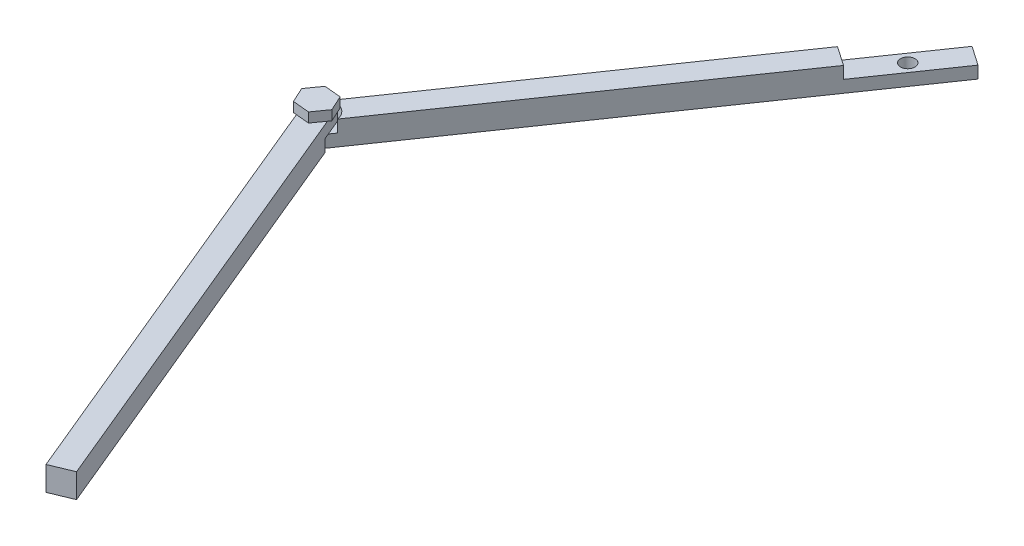
ISO-10303-21;
HEADER;
FILE_DESCRIPTION(('STEP AP214'),'2;1');
FILE_NAME('part.step','',(''),(''),'','','');
FILE_SCHEMA(('AUTOMOTIVE_DESIGN { 1 0 10303 214 1 1 1 1 }'));
ENDSEC;
DATA;
#1=APPLICATION_CONTEXT('core data for automotive mechanical design processes');
#2=APPLICATION_PROTOCOL_DEFINITION('international standard','automotive_design',2000,#1);
#3=PRODUCT_CONTEXT('',#1,'mechanical');
#4=PRODUCT('Part','Part','',(#3));
#5=PRODUCT_RELATED_PRODUCT_CATEGORY('part','',(#4));
#6=PRODUCT_DEFINITION_FORMATION('','',#4);
#7=PRODUCT_DEFINITION_CONTEXT('part definition',#1,'design');
#8=PRODUCT_DEFINITION('design','',#6,#7);
#9=PRODUCT_DEFINITION_SHAPE('','',#8);
#10=(LENGTH_UNIT() NAMED_UNIT(*) SI_UNIT(.MILLI.,.METRE.));
#11=(NAMED_UNIT(*) PLANE_ANGLE_UNIT() SI_UNIT($,.RADIAN.));
#12=(NAMED_UNIT(*) SI_UNIT($,.STERADIAN.) SOLID_ANGLE_UNIT());
#13=UNCERTAINTY_MEASURE_WITH_UNIT(LENGTH_MEASURE(1.E-05),#10,'distance_accuracy_value','');
#14=(GEOMETRIC_REPRESENTATION_CONTEXT(3) GLOBAL_UNCERTAINTY_ASSIGNED_CONTEXT((#13)) GLOBAL_UNIT_ASSIGNED_CONTEXT((#10,
#11,#12)) REPRESENTATION_CONTEXT('',''));
#15=CARTESIAN_POINT('',(0.,0.,0.));
#16=DIRECTION('',(0.,0.,1.));
#17=DIRECTION('',(1.,0.,0.));
#18=AXIS2_PLACEMENT_3D('',#15,#16,#17);
#19=CARTESIAN_POINT('',(50.9795704924562,34.6345094444511,-5.55746916131862));
#20=DIRECTION('',(0.567732858153675,0.,-0.823212853260115));
#21=DIRECTION('',(-0.823212853260115,0.,-0.567732858153675));
#22=AXIS2_PLACEMENT_3D('',#19,#20,#21);
#23=PLANE('',#22);
#24=DIRECTION('',(0.,-1.,0.));
#25=VECTOR('',#24,1.);
#26=CARTESIAN_POINT('',(50.9795704924562,34.6345094444511,-5.55746916131863));
#27=LINE('',#26,#25);
#28=CARTESIAN_POINT('',(50.9795704924562,32.1345094444511,-5.55746916131863));
#29=VERTEX_POINT('',#28);
#30=CARTESIAN_POINT('',(50.9795704924562,29.6345094444511,-5.55746916131863));
#31=VERTEX_POINT('',#30);
#32=EDGE_CURVE('P0_E169',#29,#31,#27,.T.);
#33=ORIENTED_EDGE('',*,*,#32,.F.);
#34=DIRECTION('',(0.823212853260117,0.,0.567732858153672));
#35=VECTOR('',#34,1.);
#36=CARTESIAN_POINT('',(50.9795704924562,32.1345094444511,-5.55746916131863));
#37=LINE('',#36,#35);
#38=CARTESIAN_POINT('',(54.9604379502465,32.1345094444511,-2.81204402516846));
#39=VERTEX_POINT('',#38);
#40=EDGE_CURVE('P0_E126',#29,#39,#37,.T.);
#41=ORIENTED_EDGE('',*,*,#40,.T.);
#42=DIRECTION('',(0.,-1.,0.));
#43=VECTOR('',#42,1.);
#44=CARTESIAN_POINT('',(54.9604379502465,34.6345094444511,-2.81204402516846));
#45=LINE('',#44,#43);
#46=CARTESIAN_POINT('',(54.9604379502465,29.6345094444511,-2.81204402516846));
#47=VERTEX_POINT('',#46);
#48=EDGE_CURVE('P0_E44',#39,#47,#45,.T.);
#49=ORIENTED_EDGE('',*,*,#48,.T.);
#50=DIRECTION('',(0.823212853260115,0.,0.567732858153675));
#51=VECTOR('',#50,1.);
#52=CARTESIAN_POINT('',(50.9795704924562,29.6345094444511,-5.55746916131862));
#53=LINE('',#52,#51);
#54=EDGE_CURVE('P0_E163',#31,#47,#53,.T.);
#55=ORIENTED_EDGE('',*,*,#54,.F.);
#56=EDGE_LOOP('',(#33,#41,#49,#55));
#57=FACE_BOUND('',#56,.T.);
#58=ADVANCED_FACE('P0_F36',(#57),#23,.T.);
#59=CARTESIAN_POINT('',(-5.79371532291128,34.6345094444511,76.7638161646929));
#60=DIRECTION('',(-0.567732858153675,0.,0.823212853260115));
#61=DIRECTION('',(0.823212853260115,0.,0.567732858153675));
#62=AXIS2_PLACEMENT_3D('',#59,#60,#61);
#63=PLANE('',#62);
#64=DIRECTION('',(0.823212853260115,0.,0.567732858153675));
#65=VECTOR('',#64,1.);
#66=CARTESIAN_POINT('',(-1.81284786512099,32.1345094444511,79.5092413008431));
#67=LINE('',#66,#65);
#68=CARTESIAN_POINT('',(-5.79371532291128,32.1345094444511,76.7638161646929));
#69=VERTEX_POINT('',#68);
#70=CARTESIAN_POINT('',(-1.81284786512099,32.1345094444511,79.5092413008431));
#71=VERTEX_POINT('',#70);
#72=EDGE_CURVE('P0_E134',#69,#71,#67,.T.);
#73=ORIENTED_EDGE('',*,*,#72,.F.);
#74=DIRECTION('',(0.,-1.,0.));
#75=VECTOR('',#74,1.);
#76=CARTESIAN_POINT('',(-5.79371532291128,34.6345094444511,76.7638161646929));
#77=LINE('',#76,#75);
#78=CARTESIAN_POINT('',(-5.79371532291128,29.6345094444511,76.7638161646929));
#79=VERTEX_POINT('',#78);
#80=EDGE_CURVE('P0_E154',#69,#79,#77,.T.);
#81=ORIENTED_EDGE('',*,*,#80,.T.);
#82=DIRECTION('',(-0.823212853260115,0.,-0.567732858153675));
#83=VECTOR('',#82,1.);
#84=CARTESIAN_POINT('',(-5.79371532291128,29.6345094444511,76.7638161646929));
#85=LINE('',#84,#83);
#86=CARTESIAN_POINT('',(-1.81284786512098,29.6345094444511,79.5092413008431));
#87=VERTEX_POINT('',#86);
#88=EDGE_CURVE('P0_E157',#87,#79,#85,.T.);
#89=ORIENTED_EDGE('',*,*,#88,.F.);
#90=DIRECTION('',(0.,-1.,0.));
#91=VECTOR('',#90,1.);
#92=CARTESIAN_POINT('',(-1.81284786512098,34.6345094444511,79.5092413008431));
#93=LINE('',#92,#91);
#94=EDGE_CURVE('P0_E11',#71,#87,#93,.T.);
#95=ORIENTED_EDGE('',*,*,#94,.F.);
#96=EDGE_LOOP('',(#73,#81,#89,#95));
#97=FACE_BOUND('',#96,.T.);
#98=ADVANCED_FACE('P0_F192',(#97),#63,.T.);
#99=CARTESIAN_POINT('',(-1.81284786512098,34.6345094444511,79.5092413008431));
#100=DIRECTION('',(0.823212853260115,0.,0.567732858153675));
#101=DIRECTION('',(0.567732858153675,0.,-0.823212853260115));
#102=AXIS2_PLACEMENT_3D('',#99,#100,#101);
#103=PLANE('',#102);
#104=DIRECTION('',(0.,1.,0.));
#105=VECTOR('',#104,1.);
#106=CARTESIAN_POINT('',(43.605780787173,32.1345094444511,13.6522130400339));
#107=LINE('',#106,#105);
#108=CARTESIAN_POINT('',(43.605780787173,32.1345094444511,13.6522130400339));
#109=VERTEX_POINT('',#108);
#110=CARTESIAN_POINT('',(43.605780787173,34.6345094444511,13.6522130400339));
#111=VERTEX_POINT('',#110);
#112=EDGE_CURVE('P0_E99',#109,#111,#107,.T.);
#113=ORIENTED_EDGE('',*,*,#112,.T.);
#114=DIRECTION('',(-0.567732858153675,0.,0.823212853260115));
#115=VECTOR('',#114,1.);
#116=CARTESIAN_POINT('',(-1.81284786512098,34.6345094444511,79.5092413008431));
#117=LINE('',#116,#115);
#118=CARTESIAN_POINT('',(0.907247180101118,34.6345094444511,75.5651024842205));
#119=VERTEX_POINT('',#118);
#120=EDGE_CURVE('P0_E59',#111,#119,#117,.T.);
#121=ORIENTED_EDGE('',*,*,#120,.T.);
#122=DIRECTION('',(0.,1.,0.));
#123=VECTOR('',#122,1.);
#124=CARTESIAN_POINT('',(0.907247180101116,32.1345094444511,75.5651024842205));
#125=LINE('',#124,#123);
#126=CARTESIAN_POINT('',(0.907247180101116,32.1345094444511,75.5651024842205));
#127=VERTEX_POINT('',#126);
#128=EDGE_CURVE('P0_E141',#127,#119,#125,.T.);
#129=ORIENTED_EDGE('',*,*,#128,.F.);
#130=DIRECTION('',(0.567732858153675,0.,-0.823212853260115));
#131=VECTOR('',#130,1.);
#132=CARTESIAN_POINT('',(0.907247180101116,32.1345094444511,75.5651024842205));
#133=LINE('',#132,#131);
#134=EDGE_CURVE('P0_E136',#71,#127,#133,.T.);
#135=ORIENTED_EDGE('',*,*,#134,.F.);
#136=ORIENTED_EDGE('',*,*,#94,.T.);
#137=DIRECTION('',(-0.567732858153675,0.,0.823212853260115));
#138=VECTOR('',#137,1.);
#139=CARTESIAN_POINT('',(-1.81284786512098,29.6345094444511,79.5092413008431));
#140=LINE('',#139,#138);
#141=EDGE_CURVE('P0_E160',#47,#87,#140,.T.);
#142=ORIENTED_EDGE('',*,*,#141,.F.);
#143=ORIENTED_EDGE('',*,*,#48,.F.);
#144=DIRECTION('',(-0.567732858153672,0.,0.823212853260117));
#145=VECTOR('',#144,1.);
#146=CARTESIAN_POINT('',(54.9604379502465,32.1345094444511,-2.81204402516846));
#147=LINE('',#146,#145);
#148=EDGE_CURVE('P0_E110',#39,#109,#147,.T.);
#149=ORIENTED_EDGE('',*,*,#148,.T.);
#150=EDGE_LOOP('',(#113,#121,#129,#135,#136,#142,#143,#149));
#151=FACE_BOUND('',#150,.T.);
#152=ADVANCED_FACE('P0_F116',(#151),#103,.T.);
#153=CARTESIAN_POINT('',(-2.61100080070264,34.6345094444511,76.3726295952229));
#154=DIRECTION('',(0.,-1.,0.));
#155=DIRECTION('',(0.,0.,-1.));
#156=AXIS2_PLACEMENT_3D('',#153,#154,#155);
#157=CYLINDRICAL_SURFACE('',#156,1.49969095397824);
#158=CARTESIAN_POINT('',(-2.61100080070264,32.1345094444511,76.3726295952229));
#159=DIRECTION('',(0.,-1.,0.));
#160=DIRECTION('',(0.,0.,-1.));
#161=AXIS2_PLACEMENT_3D('',#158,#159,#160);
#162=CIRCLE('',#161,1.49969095397824);
#163=CARTESIAN_POINT('',(-2.61100080070264,32.1345094444511,74.8729386412447));
#164=VERTEX_POINT('',#163);
#165=EDGE_CURVE('P0_E143',#164,#164,#162,.T.);
#166=ORIENTED_EDGE('',*,*,#165,.F.);
#167=EDGE_LOOP('',(#166));
#168=FACE_BOUND('',#167,.T.);
#169=CARTESIAN_POINT('',(-2.61100080070264,29.6345094444511,76.3726295952229));
#170=DIRECTION('',(0.,1.,0.));
#171=DIRECTION('',(0.,0.,1.));
#172=AXIS2_PLACEMENT_3D('',#169,#170,#171);
#173=CIRCLE('',#172,1.49969095397824);
#174=CARTESIAN_POINT('',(-2.61100080070264,29.6345094444511,77.8723205492012));
#175=VERTEX_POINT('',#174);
#176=EDGE_CURVE('P0_E148',#175,#175,#173,.T.);
#177=ORIENTED_EDGE('',*,*,#176,.F.);
#178=EDGE_LOOP('',(#177));
#179=FACE_BOUND('',#178,.T.);
#180=ADVANCED_FACE('P0_F38',(#168,#179),#157,.F.);
#181=CARTESIAN_POINT('',(-5.79371532291128,34.6345094444511,76.7638161646929));
#182=DIRECTION('',(-0.823212853260115,0.,-0.567732858153675));
#183=DIRECTION('',(-0.567732858153675,0.,0.823212853260115));
#184=AXIS2_PLACEMENT_3D('',#181,#182,#183);
#185=PLANE('',#184);
#186=DIRECTION('',(0.,1.,0.));
#187=VECTOR('',#186,1.);
#188=CARTESIAN_POINT('',(39.6249133293828,32.1345094444511,10.9067879038837));
#189=LINE('',#188,#187);
#190=CARTESIAN_POINT('',(39.6249133293828,32.1345094444511,10.9067879038837));
#191=VERTEX_POINT('',#190);
#192=CARTESIAN_POINT('',(39.6249133293826,34.6345094444511,10.9067879038838));
#193=VERTEX_POINT('',#192);
#194=EDGE_CURVE('P0_E51',#191,#193,#189,.T.);
#195=ORIENTED_EDGE('',*,*,#194,.F.);
#196=DIRECTION('',(-0.567732858153672,0.,0.823212853260117));
#197=VECTOR('',#196,1.);
#198=CARTESIAN_POINT('',(50.9795704924562,32.1345094444511,-5.55746916131863));
#199=LINE('',#198,#197);
#200=EDGE_CURVE('P0_E113',#29,#191,#199,.T.);
#201=ORIENTED_EDGE('',*,*,#200,.F.);
#202=ORIENTED_EDGE('',*,*,#32,.T.);
#203=DIRECTION('',(0.567732858153675,0.,-0.823212853260115));
#204=VECTOR('',#203,1.);
#205=CARTESIAN_POINT('',(-5.79371532291128,29.6345094444511,76.7638161646929));
#206=LINE('',#205,#204);
#207=EDGE_CURVE('P0_E151',#79,#31,#206,.T.);
#208=ORIENTED_EDGE('',*,*,#207,.F.);
#209=ORIENTED_EDGE('',*,*,#80,.F.);
#210=DIRECTION('',(-0.567732858153675,0.,0.823212853260115));
#211=VECTOR('',#210,1.);
#212=CARTESIAN_POINT('',(-5.79371532291128,32.1345094444511,76.7638161646929));
#213=LINE('',#212,#211);
#214=CARTESIAN_POINT('',(-3.07362027768918,32.1345094444511,72.8196773480703));
#215=VERTEX_POINT('',#214);
#216=EDGE_CURVE('P0_E132',#215,#69,#213,.T.);
#217=ORIENTED_EDGE('',*,*,#216,.F.);
#218=DIRECTION('',(0.,1.,0.));
#219=VECTOR('',#218,1.);
#220=CARTESIAN_POINT('',(-3.07362027768918,32.1345094444511,72.8196773480703));
#221=LINE('',#220,#219);
#222=CARTESIAN_POINT('',(-3.07362027768918,34.6345094444511,72.8196773480703));
#223=VERTEX_POINT('',#222);
#224=EDGE_CURVE('P0_E139',#215,#223,#221,.T.);
#225=ORIENTED_EDGE('',*,*,#224,.T.);
#226=DIRECTION('',(0.567732858153675,0.,-0.823212853260115));
#227=VECTOR('',#226,1.);
#228=CARTESIAN_POINT('',(-5.79371532291128,34.6345094444511,76.7638161646929));
#229=LINE('',#228,#227);
#230=EDGE_CURVE('P0_E150',#223,#193,#229,.T.);
#231=ORIENTED_EDGE('',*,*,#230,.T.);
#232=EDGE_LOOP('',(#195,#201,#202,#208,#209,#217,#225,#231));
#233=FACE_BOUND('',#232,.T.);
#234=ADVANCED_FACE('P0_F181',(#233),#185,.T.);
#235=CARTESIAN_POINT('',(-5.79371532291128,34.6345094444511,76.7638161646929));
#236=DIRECTION('',(0.,1.,0.));
#237=DIRECTION('',(0.,0.,1.));
#238=AXIS2_PLACEMENT_3D('',#235,#236,#237);
#239=PLANE('',#238);
#240=DIRECTION('',(0.823212853260117,0.,0.567732858153672));
#241=VECTOR('',#240,1.);
#242=CARTESIAN_POINT('',(39.6249133293828,34.6345094444511,10.9067879038837));
#243=LINE('',#242,#241);
#244=EDGE_CURVE('P0_E104',#193,#111,#243,.T.);
#245=ORIENTED_EDGE('',*,*,#244,.F.);
#246=ORIENTED_EDGE('',*,*,#230,.F.);
#247=CARTESIAN_POINT('',(-2.45589911686941,34.6345094444511,76.182823645041));
#248=DIRECTION('',(0.,1.,0.));
#249=DIRECTION('',(0.,0.,-1.));
#250=AXIS2_PLACEMENT_3D('',#247,#248,#249);
#251=CIRCLE('',#250,3.41940527685034);
#252=EDGE_CURVE('P0_E106',#119,#223,#251,.T.);
#253=ORIENTED_EDGE('',*,*,#252,.F.);
#254=ORIENTED_EDGE('',*,*,#120,.F.);
#255=EDGE_LOOP('',(#245,#246,#253,#254));
#256=FACE_BOUND('',#255,.T.);
#257=ADVANCED_FACE('P0_F186',(#256),#239,.T.);
#258=CARTESIAN_POINT('',(-5.79371532291128,29.6345094444511,76.7638161646929));
#259=DIRECTION('',(0.,1.,0.));
#260=DIRECTION('',(0.,0.,1.));
#261=AXIS2_PLACEMENT_3D('',#258,#259,#260);
#262=PLANE('',#261);
#263=CARTESIAN_POINT('',(47.2926756398146,29.6345094444511,4.04737193935762));
#264=DIRECTION('',(0.,1.,0.));
#265=DIRECTION('',(0.,0.,1.));
#266=AXIS2_PLACEMENT_3D('',#263,#264,#265);
#267=CIRCLE('',#266,1.5);
#268=CARTESIAN_POINT('',(47.2926756398146,29.6345094444511,5.54737193935762));
#269=VERTEX_POINT('',#268);
#270=EDGE_CURVE('P0_E119',#269,#269,#267,.T.);
#271=ORIENTED_EDGE('',*,*,#270,.T.);
#272=EDGE_LOOP('',(#271));
#273=FACE_BOUND('',#272,.T.);
#274=ORIENTED_EDGE('',*,*,#176,.T.);
#275=EDGE_LOOP('',(#274));
#276=FACE_BOUND('',#275,.T.);
#277=ORIENTED_EDGE('',*,*,#88,.T.);
#278=ORIENTED_EDGE('',*,*,#207,.T.);
#279=ORIENTED_EDGE('',*,*,#54,.T.);
#280=ORIENTED_EDGE('',*,*,#141,.T.);
#281=EDGE_LOOP('',(#277,#278,#279,#280));
#282=FACE_BOUND('',#281,.T.);
#283=ADVANCED_FACE('P0_F177',(#273,#276,#282),#262,.F.);
#284=CARTESIAN_POINT('',(-2.45589911686941,32.1345094444511,76.182823645041));
#285=DIRECTION('',(0.,1.,0.));
#286=DIRECTION('',(0.,0.,1.));
#287=AXIS2_PLACEMENT_3D('',#284,#285,#286);
#288=CYLINDRICAL_SURFACE('',#287,3.41940527685034);
#289=ORIENTED_EDGE('',*,*,#252,.T.);
#290=ORIENTED_EDGE('',*,*,#224,.F.);
#291=CARTESIAN_POINT('',(-2.45589911686941,32.1345094444511,76.182823645041));
#292=DIRECTION('',(0.,1.,0.));
#293=DIRECTION('',(0.,0.,-1.));
#294=AXIS2_PLACEMENT_3D('',#291,#292,#293);
#295=CIRCLE('',#294,3.41940527685034);
#296=EDGE_CURVE('P0_E129',#127,#215,#295,.T.);
#297=ORIENTED_EDGE('',*,*,#296,.F.);
#298=ORIENTED_EDGE('',*,*,#128,.T.);
#299=EDGE_LOOP('',(#289,#290,#297,#298));
#300=FACE_BOUND('',#299,.T.);
#301=ADVANCED_FACE('P0_F188',(#300),#288,.F.);
#302=CARTESIAN_POINT('',(-2.45589911686941,32.1345094444511,76.182823645041));
#303=DIRECTION('',(0.,-1.,0.));
#304=DIRECTION('',(0.,0.,-1.));
#305=AXIS2_PLACEMENT_3D('',#302,#303,#304);
#306=PLANE('',#305);
#307=ORIENTED_EDGE('',*,*,#165,.T.);
#308=EDGE_LOOP('',(#307));
#309=FACE_BOUND('',#308,.T.);
#310=ORIENTED_EDGE('',*,*,#296,.T.);
#311=ORIENTED_EDGE('',*,*,#216,.T.);
#312=ORIENTED_EDGE('',*,*,#72,.T.);
#313=ORIENTED_EDGE('',*,*,#134,.T.);
#314=EDGE_LOOP('',(#310,#311,#312,#313));
#315=FACE_BOUND('',#314,.T.);
#316=ADVANCED_FACE('P0_F193',(#309,#315),#306,.F.);
#317=CARTESIAN_POINT('',(39.6249133293828,32.1345094444511,10.9067879038837));
#318=DIRECTION('',(-0.567732858153672,0.,0.823212853260117));
#319=DIRECTION('',(0.823212853260117,0.,0.567732858153672));
#320=AXIS2_PLACEMENT_3D('',#317,#318,#319);
#321=PLANE('',#320);
#322=ORIENTED_EDGE('',*,*,#244,.T.);
#323=ORIENTED_EDGE('',*,*,#112,.F.);
#324=DIRECTION('',(0.823212853260117,0.,0.567732858153672));
#325=VECTOR('',#324,1.);
#326=CARTESIAN_POINT('',(39.6249133293828,32.1345094444511,10.9067879038837));
#327=LINE('',#326,#325);
#328=EDGE_CURVE('P0_E102',#191,#109,#327,.T.);
#329=ORIENTED_EDGE('',*,*,#328,.F.);
#330=ORIENTED_EDGE('',*,*,#194,.T.);
#331=EDGE_LOOP('',(#322,#323,#329,#330));
#332=FACE_BOUND('',#331,.T.);
#333=ADVANCED_FACE('P0_F101',(#332),#321,.F.);
#334=CARTESIAN_POINT('',(0.,32.1345094444511,0.));
#335=DIRECTION('',(0.,1.,0.));
#336=DIRECTION('',(0.,0.,1.));
#337=AXIS2_PLACEMENT_3D('',#334,#335,#336);
#338=PLANE('',#337);
#339=CARTESIAN_POINT('',(47.2926756398146,32.1345094444511,4.04737193935762));
#340=DIRECTION('',(0.,1.,0.));
#341=DIRECTION('',(0.,0.,1.));
#342=AXIS2_PLACEMENT_3D('',#339,#340,#341);
#343=CIRCLE('',#342,1.5);
#344=CARTESIAN_POINT('',(47.2926756398146,32.1345094444511,5.54737193935762));
#345=VERTEX_POINT('',#344);
#346=EDGE_CURVE('P0_E122',#345,#345,#343,.T.);
#347=ORIENTED_EDGE('',*,*,#346,.F.);
#348=EDGE_LOOP('',(#347));
#349=FACE_BOUND('',#348,.T.);
#350=ORIENTED_EDGE('',*,*,#148,.F.);
#351=ORIENTED_EDGE('',*,*,#40,.F.);
#352=ORIENTED_EDGE('',*,*,#200,.T.);
#353=ORIENTED_EDGE('',*,*,#328,.T.);
#354=EDGE_LOOP('',(#350,#351,#352,#353));
#355=FACE_BOUND('',#354,.T.);
#356=ADVANCED_FACE('P0_F109',(#349,#355),#338,.T.);
#357=CARTESIAN_POINT('',(47.2926756398146,29.6345094444511,4.04737193935762));
#358=DIRECTION('',(0.,1.,0.));
#359=DIRECTION('',(0.,0.,1.));
#360=AXIS2_PLACEMENT_3D('',#357,#358,#359);
#361=CYLINDRICAL_SURFACE('',#360,1.5);
#362=ORIENTED_EDGE('',*,*,#270,.F.);
#363=EDGE_LOOP('',(#362));
#364=FACE_BOUND('',#363,.T.);
#365=ORIENTED_EDGE('',*,*,#346,.T.);
#366=EDGE_LOOP('',(#365));
#367=FACE_BOUND('',#366,.T.);
#368=ADVANCED_FACE('P0_F241',(#364,#367),#361,.F.);
#369=CLOSED_SHELL('',(#58,#98,#152,#180,#234,#257,#283,#301,#316,#333,#356,#368));
#370=MANIFOLD_SOLID_BREP('P0_B2',#369);
#371=CARTESIAN_POINT('',(-2.61100080070264,34.4443084376079,76.3726295952229));
#372=DIRECTION('',(0.,-1.,0.));
#373=DIRECTION('',(0.0942215268961057,0.,-0.995551256274315));
#374=AXIS2_PLACEMENT_3D('',#371,#372,#373);
#375=PLANE('',#374);
#376=CARTESIAN_POINT('',(-2.61100080070264,34.4443084376079,76.3726295952229));
#377=DIRECTION('',(0.,-1.,0.));
#378=DIRECTION('',(0.0942215268961057,0.,-0.995551256274315));
#379=AXIS2_PLACEMENT_3D('',#376,#377,#378);
#380=CIRCLE('',#379,1.704);
#381=CARTESIAN_POINT('',(-2.45044731887168,34.4443084376079,74.6762102545315));
#382=VERTEX_POINT('',#381);
#383=EDGE_CURVE('P1_E126',#382,#382,#380,.F.);
#384=ORIENTED_EDGE('',*,*,#383,.T.);
#385=EDGE_LOOP('',(#384));
#386=FACE_BOUND('',#385,.T.);
#387=CARTESIAN_POINT('',(-2.61100080070264,34.4443084376079,76.3726295952229));
#388=DIRECTION('',(0.,-1.,0.));
#389=DIRECTION('',(0.0942215268961057,0.,-0.995551256274315));
#390=AXIS2_PLACEMENT_3D('',#387,#388,#389);
#391=CIRCLE('',#390,2.5);
#392=CARTESIAN_POINT('',(-2.37544698346238,34.4443084376079,73.8837514545372));
#393=VERTEX_POINT('',#392);
#394=EDGE_CURVE('P1_E107',#393,#393,#391,.T.);
#395=ORIENTED_EDGE('',*,*,#394,.T.);
#396=EDGE_LOOP('',(#395));
#397=FACE_BOUND('',#396,.T.);
#398=ADVANCED_FACE('P1_F17',(#386,#397),#375,.T.);
#399=CARTESIAN_POINT('',(-4.6180107387971,34.8507084376079,79.1960868922951));
#400=DIRECTION('',(0.,-1.,0.));
#401=DIRECTION('',(0.0942215268961057,0.,-0.995551256274315));
#402=AXIS2_PLACEMENT_3D('',#399,#400,#401);
#403=PLANE('',#402);
#404=DIRECTION('',(0.995551256274315,0.,0.0942215268961057));
#405=VECTOR('',#404,1.);
#406=CARTESIAN_POINT('',(-1.16932002398482,34.8507084376079,79.5224798357967));
#407=LINE('',#406,#405);
#408=CARTESIAN_POINT('',(-4.6180107387971,34.8507084376079,79.1960868922951));
#409=VERTEX_POINT('',#408);
#410=CARTESIAN_POINT('',(-1.16932002398482,34.8507084376079,79.5224798357967));
#411=VERTEX_POINT('',#410);
#412=EDGE_CURVE('P1_E103',#409,#411,#407,.T.);
#413=ORIENTED_EDGE('',*,*,#412,.F.);
#414=DIRECTION('',(0.416177392261775,0.,0.90928344215112));
#415=VECTOR('',#414,1.);
#416=CARTESIAN_POINT('',(-4.6180107387971,34.8507084376079,79.1960868922951));
#417=LINE('',#416,#415);
#418=CARTESIAN_POINT('',(-6.05969151551493,34.8507084376079,76.0462366517214));
#419=VERTEX_POINT('',#418);
#420=EDGE_CURVE('P1_E63',#419,#409,#417,.T.);
#421=ORIENTED_EDGE('',*,*,#420,.F.);
#422=DIRECTION('',(-0.579373864012547,0.,0.815061915255013));
#423=VECTOR('',#422,1.);
#424=CARTESIAN_POINT('',(-4.05268157742046,34.8507084376079,73.2227793546492));
#425=LINE('',#424,#423);
#426=CARTESIAN_POINT('',(-4.05268157742046,34.8507084376079,73.2227793546492));
#427=VERTEX_POINT('',#426);
#428=EDGE_CURVE('P1_E57',#427,#419,#425,.T.);
#429=ORIENTED_EDGE('',*,*,#428,.F.);
#430=DIRECTION('',(-0.995551256274315,0.,-0.0942215268961057));
#431=VECTOR('',#430,1.);
#432=CARTESIAN_POINT('',(-0.603990862608186,34.8507084376079,73.5491722981508));
#433=LINE('',#432,#431);
#434=CARTESIAN_POINT('',(-0.603990862608186,34.8507084376079,73.5491722981508));
#435=VERTEX_POINT('',#434);
#436=EDGE_CURVE('P1_E93',#435,#427,#433,.T.);
#437=ORIENTED_EDGE('',*,*,#436,.F.);
#438=DIRECTION('',(-0.416177392261776,0.,-0.909283442151119));
#439=VECTOR('',#438,1.);
#440=CARTESIAN_POINT('',(-0.603990862608186,34.8507084376079,73.5491722981508));
#441=LINE('',#440,#439);
#442=CARTESIAN_POINT('',(0.837689914109652,34.8507084376079,76.6990225387245));
#443=VERTEX_POINT('',#442);
#444=EDGE_CURVE('P1_E109',#443,#435,#441,.T.);
#445=ORIENTED_EDGE('',*,*,#444,.F.);
#446=DIRECTION('',(0.579373864012548,0.,-0.815061915255013));
#447=VECTOR('',#446,1.);
#448=CARTESIAN_POINT('',(-1.16932002398482,34.8507084376079,79.5224798357967));
#449=LINE('',#448,#447);
#450=EDGE_CURVE('P1_E106',#411,#443,#449,.T.);
#451=ORIENTED_EDGE('',*,*,#450,.F.);
#452=EDGE_LOOP('',(#413,#421,#429,#437,#445,#451));
#453=FACE_BOUND('',#452,.T.);
#454=CARTESIAN_POINT('',(-2.61100080070264,34.8507084376079,76.3726295952229));
#455=DIRECTION('',(0.,-1.,0.));
#456=DIRECTION('',(0.0942215268961057,0.,-0.995551256274315));
#457=AXIS2_PLACEMENT_3D('',#454,#455,#456);
#458=CIRCLE('',#457,2.5);
#459=CARTESIAN_POINT('',(-2.37544698346238,34.8507084376079,73.8837514545372));
#460=VERTEX_POINT('',#459);
#461=EDGE_CURVE('P1_E189',#460,#460,#458,.T.);
#462=ORIENTED_EDGE('',*,*,#461,.F.);
#463=EDGE_LOOP('',(#462));
#464=FACE_BOUND('',#463,.T.);
#465=ADVANCED_FACE('P1_F143',(#453,#464),#403,.T.);
#466=CARTESIAN_POINT('',(-1.16932002398482,36.8507084376079,79.5224798357967));
#467=DIRECTION('',(0.0942215268961057,0.,-0.995551256274315));
#468=DIRECTION('',(-0.995551256274315,0.,-0.0942215268961057));
#469=AXIS2_PLACEMENT_3D('',#466,#467,#468);
#470=PLANE('',#469);
#471=ORIENTED_EDGE('',*,*,#412,.T.);
#472=DIRECTION('',(0.,-1.,0.));
#473=VECTOR('',#472,1.);
#474=CARTESIAN_POINT('',(-1.16932002398482,36.8507084376079,79.5224798357967));
#475=LINE('',#474,#473);
#476=CARTESIAN_POINT('',(-1.16932002398482,36.8507084376079,79.5224798357967));
#477=VERTEX_POINT('',#476);
#478=EDGE_CURVE('P1_E121',#477,#411,#475,.T.);
#479=ORIENTED_EDGE('',*,*,#478,.F.);
#480=DIRECTION('',(0.995551256274315,0.,0.0942215268961057));
#481=VECTOR('',#480,1.);
#482=CARTESIAN_POINT('',(-1.16932002398482,36.8507084376079,79.5224798357967));
#483=LINE('',#482,#481);
#484=CARTESIAN_POINT('',(-4.6180107387971,36.8507084376079,79.1960868922951));
#485=VERTEX_POINT('',#484);
#486=EDGE_CURVE('P1_E114',#485,#477,#483,.T.);
#487=ORIENTED_EDGE('',*,*,#486,.F.);
#488=DIRECTION('',(0.,-1.,0.));
#489=VECTOR('',#488,1.);
#490=CARTESIAN_POINT('',(-4.6180107387971,36.8507084376079,79.1960868922951));
#491=LINE('',#490,#489);
#492=EDGE_CURVE('P1_E99',#485,#409,#491,.T.);
#493=ORIENTED_EDGE('',*,*,#492,.T.);
#494=EDGE_LOOP('',(#471,#479,#487,#493));
#495=FACE_BOUND('',#494,.T.);
#496=ADVANCED_FACE('P1_F149',(#495),#470,.F.);
#497=CARTESIAN_POINT('',(-1.16932002398482,36.8507084376079,79.5224798357967));
#498=DIRECTION('',(-0.815061915255013,0.,-0.579373864012548));
#499=DIRECTION('',(-0.579373864012548,0.,0.815061915255013));
#500=AXIS2_PLACEMENT_3D('',#497,#498,#499);
#501=PLANE('',#500);
#502=ORIENTED_EDGE('',*,*,#450,.T.);
#503=DIRECTION('',(0.,-1.,0.));
#504=VECTOR('',#503,1.);
#505=CARTESIAN_POINT('',(0.837689914109652,36.8507084376079,76.6990225387245));
#506=LINE('',#505,#504);
#507=CARTESIAN_POINT('',(0.837689914109652,36.8507084376079,76.6990225387245));
#508=VERTEX_POINT('',#507);
#509=EDGE_CURVE('P1_E118',#508,#443,#506,.T.);
#510=ORIENTED_EDGE('',*,*,#509,.F.);
#511=DIRECTION('',(0.579373864012548,0.,-0.815061915255013));
#512=VECTOR('',#511,1.);
#513=CARTESIAN_POINT('',(-1.16932002398482,36.8507084376079,79.5224798357967));
#514=LINE('',#513,#512);
#515=EDGE_CURVE('P1_E72',#477,#508,#514,.T.);
#516=ORIENTED_EDGE('',*,*,#515,.F.);
#517=ORIENTED_EDGE('',*,*,#478,.T.);
#518=EDGE_LOOP('',(#502,#510,#516,#517));
#519=FACE_BOUND('',#518,.T.);
#520=ADVANCED_FACE('P1_F173',(#519),#501,.F.);
#521=CARTESIAN_POINT('',(-0.603990862608186,36.8507084376079,73.5491722981508));
#522=DIRECTION('',(-0.909283442151119,0.,0.416177392261776));
#523=DIRECTION('',(0.416177392261776,0.,0.909283442151119));
#524=AXIS2_PLACEMENT_3D('',#521,#522,#523);
#525=PLANE('',#524);
#526=ORIENTED_EDGE('',*,*,#444,.T.);
#527=DIRECTION('',(0.,-1.,0.));
#528=VECTOR('',#527,1.);
#529=CARTESIAN_POINT('',(-0.603990862608186,36.8507084376079,73.5491722981508));
#530=LINE('',#529,#528);
#531=CARTESIAN_POINT('',(-0.603990862608186,36.8507084376079,73.5491722981508));
#532=VERTEX_POINT('',#531);
#533=EDGE_CURVE('P1_E94',#532,#435,#530,.T.);
#534=ORIENTED_EDGE('',*,*,#533,.F.);
#535=DIRECTION('',(-0.416177392261776,0.,-0.909283442151119));
#536=VECTOR('',#535,1.);
#537=CARTESIAN_POINT('',(-0.603990862608186,36.8507084376079,73.5491722981508));
#538=LINE('',#537,#536);
#539=EDGE_CURVE('P1_E85',#508,#532,#538,.T.);
#540=ORIENTED_EDGE('',*,*,#539,.F.);
#541=ORIENTED_EDGE('',*,*,#509,.T.);
#542=EDGE_LOOP('',(#526,#534,#540,#541));
#543=FACE_BOUND('',#542,.T.);
#544=ADVANCED_FACE('P1_F170',(#543),#525,.F.);
#545=CARTESIAN_POINT('',(-0.603990862608186,36.8507084376079,73.5491722981508));
#546=DIRECTION('',(-0.0942215268961057,0.,0.995551256274315));
#547=DIRECTION('',(0.995551256274315,0.,0.0942215268961057));
#548=AXIS2_PLACEMENT_3D('',#545,#546,#547);
#549=PLANE('',#548);
#550=ORIENTED_EDGE('',*,*,#436,.T.);
#551=DIRECTION('',(0.,-1.,0.));
#552=VECTOR('',#551,1.);
#553=CARTESIAN_POINT('',(-4.05268157742046,36.8507084376079,73.2227793546492));
#554=LINE('',#553,#552);
#555=CARTESIAN_POINT('',(-4.05268157742046,36.8507084376079,73.2227793546492));
#556=VERTEX_POINT('',#555);
#557=EDGE_CURVE('P1_E90',#556,#427,#554,.T.);
#558=ORIENTED_EDGE('',*,*,#557,.F.);
#559=DIRECTION('',(-0.995551256274315,0.,-0.0942215268961057));
#560=VECTOR('',#559,1.);
#561=CARTESIAN_POINT('',(-0.603990862608186,36.8507084376079,73.5491722981508));
#562=LINE('',#561,#560);
#563=EDGE_CURVE('P1_E79',#532,#556,#562,.T.);
#564=ORIENTED_EDGE('',*,*,#563,.F.);
#565=ORIENTED_EDGE('',*,*,#533,.T.);
#566=EDGE_LOOP('',(#550,#558,#564,#565));
#567=FACE_BOUND('',#566,.T.);
#568=ADVANCED_FACE('P1_F91',(#567),#549,.F.);
#569=CARTESIAN_POINT('',(-4.05268157742046,36.8507084376079,73.2227793546492));
#570=DIRECTION('',(0.815061915255013,0.,0.579373864012547));
#571=DIRECTION('',(0.579373864012547,0.,-0.815061915255013));
#572=AXIS2_PLACEMENT_3D('',#569,#570,#571);
#573=PLANE('',#572);
#574=ORIENTED_EDGE('',*,*,#428,.T.);
#575=DIRECTION('',(0.,-1.,0.));
#576=VECTOR('',#575,1.);
#577=CARTESIAN_POINT('',(-6.05969151551493,36.8507084376079,76.0462366517214));
#578=LINE('',#577,#576);
#579=CARTESIAN_POINT('',(-6.05969151551493,36.8507084376079,76.0462366517214));
#580=VERTEX_POINT('',#579);
#581=EDGE_CURVE('P1_E95',#580,#419,#578,.T.);
#582=ORIENTED_EDGE('',*,*,#581,.F.);
#583=DIRECTION('',(-0.579373864012547,0.,0.815061915255013));
#584=VECTOR('',#583,1.);
#585=CARTESIAN_POINT('',(-4.05268157742046,36.8507084376079,73.2227793546492));
#586=LINE('',#585,#584);
#587=EDGE_CURVE('P1_E83',#556,#580,#586,.T.);
#588=ORIENTED_EDGE('',*,*,#587,.F.);
#589=ORIENTED_EDGE('',*,*,#557,.T.);
#590=EDGE_LOOP('',(#574,#582,#588,#589));
#591=FACE_BOUND('',#590,.T.);
#592=ADVANCED_FACE('P1_F97',(#591),#573,.F.);
#593=CARTESIAN_POINT('',(-4.6180107387971,36.8507084376079,79.1960868922951));
#594=DIRECTION('',(0.90928344215112,0.,-0.416177392261775));
#595=DIRECTION('',(-0.416177392261775,0.,-0.90928344215112));
#596=AXIS2_PLACEMENT_3D('',#593,#594,#595);
#597=PLANE('',#596);
#598=ORIENTED_EDGE('',*,*,#420,.T.);
#599=ORIENTED_EDGE('',*,*,#492,.F.);
#600=DIRECTION('',(0.416177392261775,0.,0.90928344215112));
#601=VECTOR('',#600,1.);
#602=CARTESIAN_POINT('',(-4.6180107387971,36.8507084376079,79.1960868922951));
#603=LINE('',#602,#601);
#604=EDGE_CURVE('P1_E34',#580,#485,#603,.T.);
#605=ORIENTED_EDGE('',*,*,#604,.F.);
#606=ORIENTED_EDGE('',*,*,#581,.T.);
#607=EDGE_LOOP('',(#598,#599,#605,#606));
#608=FACE_BOUND('',#607,.T.);
#609=ADVANCED_FACE('P1_F162',(#608),#597,.F.);
#610=CARTESIAN_POINT('',(-4.6180107387971,36.8507084376079,79.1960868922951));
#611=DIRECTION('',(0.,-1.,0.));
#612=DIRECTION('',(0.0942215268961057,0.,-0.995551256274315));
#613=AXIS2_PLACEMENT_3D('',#610,#611,#612);
#614=PLANE('',#613);
#615=ORIENTED_EDGE('',*,*,#486,.T.);
#616=ORIENTED_EDGE('',*,*,#515,.T.);
#617=ORIENTED_EDGE('',*,*,#539,.T.);
#618=ORIENTED_EDGE('',*,*,#563,.T.);
#619=ORIENTED_EDGE('',*,*,#587,.T.);
#620=ORIENTED_EDGE('',*,*,#604,.T.);
#621=EDGE_LOOP('',(#615,#616,#617,#618,#619,#620));
#622=FACE_BOUND('',#621,.T.);
#623=ADVANCED_FACE('P1_F81',(#622),#614,.F.);
#624=CARTESIAN_POINT('',(-2.61100080070264,34.4443084376079,76.3726295952229));
#625=DIRECTION('',(0.,1.,0.));
#626=DIRECTION('',(-0.0942215268961057,0.,0.995551256274315));
#627=AXIS2_PLACEMENT_3D('',#624,#625,#626);
#628=CYLINDRICAL_SURFACE('',#627,2.5);
#629=ORIENTED_EDGE('',*,*,#394,.F.);
#630=EDGE_LOOP('',(#629));
#631=FACE_BOUND('',#630,.T.);
#632=ORIENTED_EDGE('',*,*,#461,.T.);
#633=EDGE_LOOP('',(#632));
#634=FACE_BOUND('',#633,.T.);
#635=ADVANCED_FACE('P1_F157',(#631,#634),#628,.T.);
#636=CARTESIAN_POINT('',(-2.61100080070264,29.4443084376079,76.3726295952229));
#637=DIRECTION('',(0.,1.,0.));
#638=DIRECTION('',(-0.0942215268961057,0.,0.995551256274315));
#639=AXIS2_PLACEMENT_3D('',#636,#637,#638);
#640=CYLINDRICAL_SURFACE('',#639,1.45);
#641=CARTESIAN_POINT('',(-2.61100080070264,29.8253084376079,76.3726295952229));
#642=DIRECTION('',(0.,-1.,0.));
#643=DIRECTION('',(0.0942215268961057,0.,-0.995551256274315));
#644=AXIS2_PLACEMENT_3D('',#641,#642,#643);
#645=CIRCLE('',#644,1.45);
#646=CARTESIAN_POINT('',(-2.47437958670329,29.8253084376079,74.9290802736252));
#647=VERTEX_POINT('',#646);
#648=EDGE_CURVE('P1_E11',#647,#647,#645,.F.);
#649=ORIENTED_EDGE('',*,*,#648,.T.);
#650=EDGE_LOOP('',(#649));
#651=FACE_BOUND('',#650,.T.);
#652=CARTESIAN_POINT('',(-2.61100080070264,34.1903084376079,76.3726295952229));
#653=DIRECTION('',(0.,-1.,0.));
#654=DIRECTION('',(0.0942215268961057,0.,-0.995551256274315));
#655=AXIS2_PLACEMENT_3D('',#652,#653,#654);
#656=CIRCLE('',#655,1.45);
#657=CARTESIAN_POINT('',(-2.47437958670329,34.1903084376079,74.9290802736252));
#658=VERTEX_POINT('',#657);
#659=EDGE_CURVE('P1_E123',#658,#658,#656,.T.);
#660=ORIENTED_EDGE('',*,*,#659,.T.);
#661=EDGE_LOOP('',(#660));
#662=FACE_BOUND('',#661,.T.);
#663=ADVANCED_FACE('P1_F155',(#651,#662),#640,.T.);
#664=CARTESIAN_POINT('',(-2.61100080070264,29.4443084376079,76.3726295952229));
#665=DIRECTION('',(0.,-1.,0.));
#666=DIRECTION('',(0.0942215268961057,0.,-0.995551256274315));
#667=AXIS2_PLACEMENT_3D('',#664,#665,#666);
#668=PLANE('',#667);
#669=CARTESIAN_POINT('',(-2.61100080070264,29.4443084376079,76.3726295952229));
#670=DIRECTION('',(0.,-1.,0.));
#671=DIRECTION('',(0.0942215268961057,0.,-0.995551256274315));
#672=AXIS2_PLACEMENT_3D('',#669,#670,#671);
#673=CIRCLE('',#672,1.069);
#674=CARTESIAN_POINT('',(-2.51027798845071,29.4443084376079,75.3083853022657));
#675=VERTEX_POINT('',#674);
#676=EDGE_CURVE('P1_E26',#675,#675,#673,.T.);
#677=ORIENTED_EDGE('',*,*,#676,.T.);
#678=EDGE_LOOP('',(#677));
#679=FACE_BOUND('',#678,.T.);
#680=ADVANCED_FACE('P1_F131',(#679),#668,.T.);
#681=CARTESIAN_POINT('',(-2.61100080070264,34.1903084376079,76.3726295952229));
#682=DIRECTION('',(0.,-1.,0.));
#683=DIRECTION('',(0.0942215268961057,0.,-0.995551256274315));
#684=AXIS2_PLACEMENT_3D('',#681,#682,#683);
#685=TOROIDAL_SURFACE('',#684,1.704,0.254);
#686=ORIENTED_EDGE('',*,*,#383,.F.);
#687=EDGE_LOOP('',(#686));
#688=FACE_BOUND('',#687,.T.);
#689=ORIENTED_EDGE('',*,*,#659,.F.);
#690=EDGE_LOOP('',(#689));
#691=FACE_BOUND('',#690,.T.);
#692=ADVANCED_FACE('P1_F134',(#688,#691),#685,.F.);
#693=CARTESIAN_POINT('',(-2.61100080070264,29.4443084376079,76.3726295952229));
#694=DIRECTION('',(0.,1.,0.));
#695=DIRECTION('',(-0.0942215268961057,0.,0.995551256274315));
#696=AXIS2_PLACEMENT_3D('',#693,#694,#695);
#697=CONICAL_SURFACE('',#696,1.069,0.785398163397447);
#698=ORIENTED_EDGE('',*,*,#648,.F.);
#699=EDGE_LOOP('',(#698));
#700=FACE_BOUND('',#699,.T.);
#701=ORIENTED_EDGE('',*,*,#676,.F.);
#702=EDGE_LOOP('',(#701));
#703=FACE_BOUND('',#702,.T.);
#704=ADVANCED_FACE('P1_F19',(#700,#703),#697,.T.);
#705=CLOSED_SHELL('',(#398,#465,#496,#520,#544,#568,#592,#609,#623,#635,#663,#680,#692,#704));
#706=MANIFOLD_SOLID_BREP('P1_B1',#705);
#707=CARTESIAN_POINT('',(-5.64197385568157,29.7225873032574,75.3257766915146));
#708=DIRECTION('',(-0.383412110376767,0.,-0.923577367423235));
#709=DIRECTION('',(0.923577367423235,0.,-0.383412110376767));
#710=AXIS2_PLACEMENT_3D('',#707,#708,#709);
#711=PLANE('',#710);
#712=DIRECTION('',(0.923577367423235,0.,-0.383412110376767));
#713=VECTOR('',#712,1.);
#714=CARTESIAN_POINT('',(-1.17576675970824,32.2225873032574,73.4716841720927));
#715=LINE('',#714,#713);
#716=CARTESIAN_POINT('',(-5.64197385568157,32.2225873032574,75.3257766915146));
#717=VERTEX_POINT('',#716);
#718=CARTESIAN_POINT('',(-1.17576675970824,32.2225873032574,73.4716841720927));
#719=VERTEX_POINT('',#718);
#720=EDGE_CURVE('P2_E68',#717,#719,#715,.T.);
#721=ORIENTED_EDGE('',*,*,#720,.F.);
#722=DIRECTION('',(0.,1.,0.));
#723=VECTOR('',#722,1.);
#724=CARTESIAN_POINT('',(-5.64197385568157,29.7225873032574,75.3257766915146));
#725=LINE('',#724,#723);
#726=CARTESIAN_POINT('',(-5.64197385568158,34.7225873032574,75.3257766915146));
#727=VERTEX_POINT('',#726);
#728=EDGE_CURVE('P2_E61',#717,#727,#725,.T.);
#729=ORIENTED_EDGE('',*,*,#728,.T.);
#730=DIRECTION('',(-0.923577367423235,0.,0.383412110376767));
#731=VECTOR('',#730,1.);
#732=CARTESIAN_POINT('',(-5.64197385568158,34.7225873032574,75.3257766915146));
#733=LINE('',#732,#731);
#734=CARTESIAN_POINT('',(-1.17576675970823,34.7225873032574,73.4716841720927));
#735=VERTEX_POINT('',#734);
#736=EDGE_CURVE('P2_E64',#735,#727,#733,.T.);
#737=ORIENTED_EDGE('',*,*,#736,.F.);
#738=DIRECTION('',(0.,1.,0.));
#739=VECTOR('',#738,1.);
#740=CARTESIAN_POINT('',(-1.17576675970823,29.7225873032574,73.4716841720927));
#741=LINE('',#740,#739);
#742=EDGE_CURVE('P2_E11',#719,#735,#741,.T.);
#743=ORIENTED_EDGE('',*,*,#742,.F.);
#744=EDGE_LOOP('',(#721,#729,#737,#743));
#745=FACE_BOUND('',#744,.T.);
#746=ADVANCED_FACE('P2_F17',(#745),#711,.T.);
#747=CARTESIAN_POINT('',(-1.17576675970823,29.7225873032574,73.4716841720927));
#748=DIRECTION('',(0.923577367423235,0.,-0.383412110376767));
#749=DIRECTION('',(0.383412110376767,0.,0.923577367423235));
#750=AXIS2_PLACEMENT_3D('',#747,#748,#749);
#751=PLANE('',#750);
#752=DIRECTION('',(0.,-1.,0.));
#753=VECTOR('',#752,1.);
#754=CARTESIAN_POINT('',(0.661219362789004,32.2225873032574,77.896684742215));
#755=LINE('',#754,#753);
#756=CARTESIAN_POINT('',(0.661219362789004,32.2225873032574,77.896684742215));
#757=VERTEX_POINT('',#756);
#758=CARTESIAN_POINT('',(0.661219362789007,29.7225873032574,77.896684742215));
#759=VERTEX_POINT('',#758);
#760=EDGE_CURVE('P2_E33',#757,#759,#755,.T.);
#761=ORIENTED_EDGE('',*,*,#760,.F.);
#762=DIRECTION('',(0.383412110376768,0.,0.923577367423235));
#763=VECTOR('',#762,1.);
#764=CARTESIAN_POINT('',(0.661219362789004,32.2225873032574,77.896684742215));
#765=LINE('',#764,#763);
#766=EDGE_CURVE('P2_E125',#719,#757,#765,.T.);
#767=ORIENTED_EDGE('',*,*,#766,.F.);
#768=ORIENTED_EDGE('',*,*,#742,.T.);
#769=DIRECTION('',(-0.383412110376767,0.,-0.923577367423235));
#770=VECTOR('',#769,1.);
#771=CARTESIAN_POINT('',(-1.17576675970823,34.7225873032574,73.4716841720927));
#772=LINE('',#771,#770);
#773=CARTESIAN_POINT('',(37.1654442779685,34.7225873032574,165.829420914416));
#774=VERTEX_POINT('',#773);
#775=EDGE_CURVE('P2_E80',#774,#735,#772,.T.);
#776=ORIENTED_EDGE('',*,*,#775,.F.);
#777=DIRECTION('',(0.,1.,0.));
#778=VECTOR('',#777,1.);
#779=CARTESIAN_POINT('',(37.1654442779685,29.7225873032574,165.829420914416));
#780=LINE('',#779,#778);
#781=CARTESIAN_POINT('',(37.1654442779685,29.7225873032574,165.829420914416));
#782=VERTEX_POINT('',#781);
#783=EDGE_CURVE('P2_E26',#782,#774,#780,.T.);
#784=ORIENTED_EDGE('',*,*,#783,.F.);
#785=DIRECTION('',(-0.383412110376767,0.,-0.923577367423235));
#786=VECTOR('',#785,1.);
#787=CARTESIAN_POINT('',(-1.17576675970823,29.7225873032574,73.4716841720927));
#788=LINE('',#787,#786);
#789=EDGE_CURVE('P2_E87',#782,#759,#788,.T.);
#790=ORIENTED_EDGE('',*,*,#789,.T.);
#791=EDGE_LOOP('',(#761,#767,#768,#776,#784,#790));
#792=FACE_BOUND('',#791,.T.);
#793=ADVANCED_FACE('P2_F107',(#792),#751,.T.);
#794=CARTESIAN_POINT('',(32.6992371819952,29.7225873032574,167.683513433838));
#795=DIRECTION('',(0.383412110376768,0.,0.923577367423235));
#796=DIRECTION('',(-0.923577367423235,0.,0.383412110376768));
#797=AXIS2_PLACEMENT_3D('',#794,#795,#796);
#798=PLANE('',#797);
#799=DIRECTION('',(0.923577367423235,0.,-0.383412110376768));
#800=VECTOR('',#799,1.);
#801=CARTESIAN_POINT('',(32.6992371819952,34.7225873032574,167.683513433838));
#802=LINE('',#801,#800);
#803=CARTESIAN_POINT('',(32.6992371819952,34.7225873032574,167.683513433838));
#804=VERTEX_POINT('',#803);
#805=EDGE_CURVE('P2_E88',#804,#774,#802,.T.);
#806=ORIENTED_EDGE('',*,*,#805,.F.);
#807=DIRECTION('',(0.,1.,0.));
#808=VECTOR('',#807,1.);
#809=CARTESIAN_POINT('',(32.6992371819952,29.7225873032574,167.683513433838));
#810=LINE('',#809,#808);
#811=CARTESIAN_POINT('',(32.6992371819952,29.7225873032574,167.683513433838));
#812=VERTEX_POINT('',#811);
#813=EDGE_CURVE('P2_E72',#812,#804,#810,.T.);
#814=ORIENTED_EDGE('',*,*,#813,.F.);
#815=DIRECTION('',(0.923577367423235,0.,-0.383412110376768));
#816=VECTOR('',#815,1.);
#817=CARTESIAN_POINT('',(32.6992371819952,29.7225873032574,167.683513433838));
#818=LINE('',#817,#816);
#819=EDGE_CURVE('P2_E94',#812,#782,#818,.T.);
#820=ORIENTED_EDGE('',*,*,#819,.T.);
#821=ORIENTED_EDGE('',*,*,#783,.T.);
#822=EDGE_LOOP('',(#806,#814,#820,#821));
#823=FACE_BOUND('',#822,.T.);
#824=ADVANCED_FACE('P2_F103',(#823),#798,.T.);
#825=CARTESIAN_POINT('',(-2.61100080070263,29.7225873032574,76.3726295952231));
#826=DIRECTION('',(0.,1.,0.));
#827=DIRECTION('',(-0.208715441175499,0.,0.977976413117881));
#828=AXIS2_PLACEMENT_3D('',#825,#826,#827);
#829=CYLINDRICAL_SURFACE('',#828,1.49969095397824);
#830=CARTESIAN_POINT('',(-2.61100080070263,32.2225873032574,76.3726295952231));
#831=DIRECTION('',(0.,1.,0.));
#832=DIRECTION('',(-0.208715441175499,0.,0.977976413117881));
#833=AXIS2_PLACEMENT_3D('',#830,#831,#832);
#834=CIRCLE('',#833,1.49969095397824);
#835=CARTESIAN_POINT('',(-2.92400945978911,32.2225873032574,77.8392919751801));
#836=VERTEX_POINT('',#835);
#837=EDGE_CURVE('P2_E114',#836,#836,#834,.T.);
#838=ORIENTED_EDGE('',*,*,#837,.F.);
#839=EDGE_LOOP('',(#838));
#840=FACE_BOUND('',#839,.T.);
#841=CARTESIAN_POINT('',(-2.61100080070264,34.7225873032574,76.3726295952231));
#842=DIRECTION('',(0.,-1.,0.));
#843=DIRECTION('',(0.208715441175499,0.,-0.977976413117881));
#844=AXIS2_PLACEMENT_3D('',#841,#842,#843);
#845=CIRCLE('',#844,1.49969095397824);
#846=CARTESIAN_POINT('',(-2.29799214161616,34.7225873032574,74.9059672152662));
#847=VERTEX_POINT('',#846);
#848=EDGE_CURVE('P2_E82',#847,#847,#845,.T.);
#849=ORIENTED_EDGE('',*,*,#848,.F.);
#850=EDGE_LOOP('',(#849));
#851=FACE_BOUND('',#850,.T.);
#852=ADVANCED_FACE('P2_F19',(#840,#851),#829,.F.);
#853=CARTESIAN_POINT('',(-5.64197385568157,29.7225873032574,75.3257766915146));
#854=DIRECTION('',(-0.923577367423235,0.,0.383412110376768));
#855=DIRECTION('',(-0.383412110376768,0.,-0.923577367423235));
#856=AXIS2_PLACEMENT_3D('',#853,#854,#855);
#857=PLANE('',#856);
#858=DIRECTION('',(0.,-1.,0.));
#859=VECTOR('',#858,1.);
#860=CARTESIAN_POINT('',(-3.80498773318434,32.2225873032574,79.750777261637));
#861=LINE('',#860,#859);
#862=CARTESIAN_POINT('',(-3.80498773318434,32.2225873032574,79.750777261637));
#863=VERTEX_POINT('',#862);
#864=CARTESIAN_POINT('',(-3.80498773318434,29.7225873032574,79.750777261637));
#865=VERTEX_POINT('',#864);
#866=EDGE_CURVE('P2_E122',#863,#865,#861,.T.);
#867=ORIENTED_EDGE('',*,*,#866,.T.);
#868=DIRECTION('',(0.383412110376768,0.,0.923577367423235));
#869=VECTOR('',#868,1.);
#870=CARTESIAN_POINT('',(-5.64197385568157,29.7225873032574,75.3257766915146));
#871=LINE('',#870,#869);
#872=EDGE_CURVE('P2_E42',#865,#812,#871,.T.);
#873=ORIENTED_EDGE('',*,*,#872,.T.);
#874=ORIENTED_EDGE('',*,*,#813,.T.);
#875=DIRECTION('',(0.383412110376768,0.,0.923577367423235));
#876=VECTOR('',#875,1.);
#877=CARTESIAN_POINT('',(-5.64197385568158,34.7225873032574,75.3257766915146));
#878=LINE('',#877,#876);
#879=EDGE_CURVE('P2_E78',#727,#804,#878,.T.);
#880=ORIENTED_EDGE('',*,*,#879,.F.);
#881=ORIENTED_EDGE('',*,*,#728,.F.);
#882=DIRECTION('',(-0.383412110376768,0.,-0.923577367423235));
#883=VECTOR('',#882,1.);
#884=CARTESIAN_POINT('',(-5.64197385568157,32.2225873032574,75.3257766915146));
#885=LINE('',#884,#883);
#886=EDGE_CURVE('P2_E137',#863,#717,#885,.T.);
#887=ORIENTED_EDGE('',*,*,#886,.F.);
#888=EDGE_LOOP('',(#867,#873,#874,#880,#881,#887));
#889=FACE_BOUND('',#888,.T.);
#890=ADVANCED_FACE('P2_F84',(#889),#857,.T.);
#891=CARTESIAN_POINT('',(-5.64197385568157,29.7225873032574,75.3257766915146));
#892=DIRECTION('',(0.,-1.,0.));
#893=DIRECTION('',(0.208715441175499,0.,-0.977976413117881));
#894=AXIS2_PLACEMENT_3D('',#891,#892,#893);
#895=PLANE('',#894);
#896=CARTESIAN_POINT('',(-2.49893044490883,29.7225873032574,76.5906274539389));
#897=DIRECTION('',(0.,-1.,0.));
#898=DIRECTION('',(-0.208715441175499,0.,0.977976413117881));
#899=AXIS2_PLACEMENT_3D('',#896,#897,#898);
#900=CIRCLE('',#899,3.41940527685034);
#901=EDGE_CURVE('P2_E128',#759,#865,#900,.T.);
#902=ORIENTED_EDGE('',*,*,#901,.F.);
#903=ORIENTED_EDGE('',*,*,#789,.F.);
#904=ORIENTED_EDGE('',*,*,#819,.F.);
#905=ORIENTED_EDGE('',*,*,#872,.F.);
#906=EDGE_LOOP('',(#902,#903,#904,#905));
#907=FACE_BOUND('',#906,.T.);
#908=ADVANCED_FACE('P2_F150',(#907),#895,.T.);
#909=CARTESIAN_POINT('',(-5.64197385568158,34.7225873032574,75.3257766915146));
#910=DIRECTION('',(0.,-1.,0.));
#911=DIRECTION('',(0.208715441175499,0.,-0.977976413117881));
#912=AXIS2_PLACEMENT_3D('',#909,#910,#911);
#913=PLANE('',#912);
#914=ORIENTED_EDGE('',*,*,#848,.T.);
#915=EDGE_LOOP('',(#914));
#916=FACE_BOUND('',#915,.T.);
#917=ORIENTED_EDGE('',*,*,#736,.T.);
#918=ORIENTED_EDGE('',*,*,#879,.T.);
#919=ORIENTED_EDGE('',*,*,#805,.T.);
#920=ORIENTED_EDGE('',*,*,#775,.T.);
#921=EDGE_LOOP('',(#917,#918,#919,#920));
#922=FACE_BOUND('',#921,.T.);
#923=ADVANCED_FACE('P2_F76',(#916,#922),#913,.F.);
#924=CARTESIAN_POINT('',(-2.49893044490883,32.2225873032574,76.5906274539389));
#925=DIRECTION('',(0.,-1.,0.));
#926=DIRECTION('',(0.208715441175499,0.,-0.977976413117881));
#927=AXIS2_PLACEMENT_3D('',#924,#925,#926);
#928=CYLINDRICAL_SURFACE('',#927,3.41940527685034);
#929=ORIENTED_EDGE('',*,*,#901,.T.);
#930=ORIENTED_EDGE('',*,*,#866,.F.);
#931=CARTESIAN_POINT('',(-2.49893044490883,32.2225873032574,76.5906274539389));
#932=DIRECTION('',(0.,-1.,0.));
#933=DIRECTION('',(-0.208715441175499,0.,0.977976413117881));
#934=AXIS2_PLACEMENT_3D('',#931,#932,#933);
#935=CIRCLE('',#934,3.41940527685034);
#936=EDGE_CURVE('P2_E131',#757,#863,#935,.T.);
#937=ORIENTED_EDGE('',*,*,#936,.F.);
#938=ORIENTED_EDGE('',*,*,#760,.T.);
#939=EDGE_LOOP('',(#929,#930,#937,#938));
#940=FACE_BOUND('',#939,.T.);
#941=ADVANCED_FACE('P2_F155',(#940),#928,.F.);
#942=CARTESIAN_POINT('',(-2.49893044490883,32.2225873032574,76.5906274539389));
#943=DIRECTION('',(0.,1.,0.));
#944=DIRECTION('',(-0.208715441175499,0.,0.977976413117881));
#945=AXIS2_PLACEMENT_3D('',#942,#943,#944);
#946=PLANE('',#945);
#947=ORIENTED_EDGE('',*,*,#837,.T.);
#948=EDGE_LOOP('',(#947));
#949=FACE_BOUND('',#948,.T.);
#950=ORIENTED_EDGE('',*,*,#936,.T.);
#951=ORIENTED_EDGE('',*,*,#886,.T.);
#952=ORIENTED_EDGE('',*,*,#720,.T.);
#953=ORIENTED_EDGE('',*,*,#766,.T.);
#954=EDGE_LOOP('',(#950,#951,#952,#953));
#955=FACE_BOUND('',#954,.T.);
#956=ADVANCED_FACE('P2_F145',(#949,#955),#946,.F.);
#957=CLOSED_SHELL('',(#746,#793,#824,#852,#890,#908,#923,#941,#956));
#958=MANIFOLD_SOLID_BREP('P2_B1',#957);
#959=ADVANCED_BREP_SHAPE_REPRESENTATION('',(#18,#370,#706,#958),#14);
#960=SHAPE_DEFINITION_REPRESENTATION(#9,#959);
ENDSEC;
END-ISO-10303-21;
